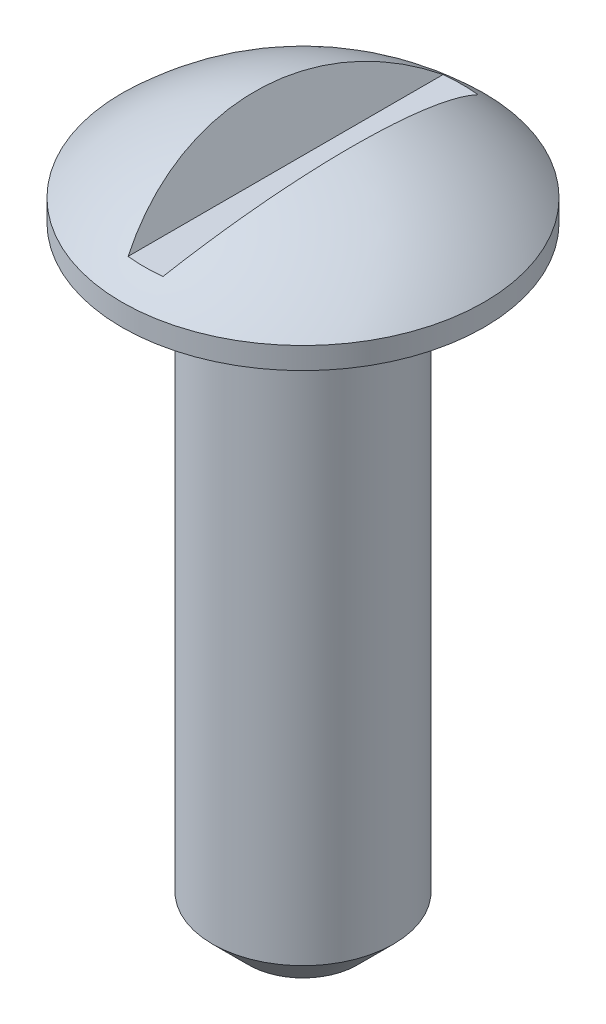
ISO-10303-21;
HEADER;
FILE_DESCRIPTION(('STEP AP214'),'2;1');
FILE_NAME('part.step','',(''),(''),'','','');
FILE_SCHEMA(('AUTOMOTIVE_DESIGN { 1 0 10303 214 1 1 1 1 }'));
ENDSEC;
DATA;
#1=APPLICATION_CONTEXT('core data for automotive mechanical design processes');
#2=APPLICATION_PROTOCOL_DEFINITION('international standard','automotive_design',2000,#1);
#3=PRODUCT_CONTEXT('',#1,'mechanical');
#4=PRODUCT('Part','Part','',(#3));
#5=PRODUCT_RELATED_PRODUCT_CATEGORY('part','',(#4));
#6=PRODUCT_DEFINITION_FORMATION('','',#4);
#7=PRODUCT_DEFINITION_CONTEXT('part definition',#1,'design');
#8=PRODUCT_DEFINITION('design','',#6,#7);
#9=PRODUCT_DEFINITION_SHAPE('','',#8);
#10=(LENGTH_UNIT() NAMED_UNIT(*) SI_UNIT(.MILLI.,.METRE.));
#11=(NAMED_UNIT(*) PLANE_ANGLE_UNIT() SI_UNIT($,.RADIAN.));
#12=(NAMED_UNIT(*) SI_UNIT($,.STERADIAN.) SOLID_ANGLE_UNIT());
#13=UNCERTAINTY_MEASURE_WITH_UNIT(LENGTH_MEASURE(1.E-05),#10,'distance_accuracy_value','');
#14=(GEOMETRIC_REPRESENTATION_CONTEXT(3) GLOBAL_UNCERTAINTY_ASSIGNED_CONTEXT((#13)) GLOBAL_UNIT_ASSIGNED_CONTEXT((#10,
#11,#12)) REPRESENTATION_CONTEXT('',''));
#15=CARTESIAN_POINT('',(0.,0.,0.));
#16=DIRECTION('',(0.,0.,1.));
#17=DIRECTION('',(1.,0.,0.));
#18=AXIS2_PLACEMENT_3D('',#15,#16,#17);
#19=CARTESIAN_POINT('',(0.,0.,0.));
#20=DIRECTION('',(0.,-1.,0.));
#21=DIRECTION('',(0.,0.,-1.));
#22=AXIS2_PLACEMENT_3D('',#19,#20,#21);
#23=PLANE('',#22);
#24=CARTESIAN_POINT('',(0.,0.,0.));
#25=DIRECTION('',(0.,-1.,0.));
#26=DIRECTION('',(0.,0.,-1.));
#27=AXIS2_PLACEMENT_3D('',#24,#25,#26);
#28=CIRCLE('',#27,3.81);
#29=CARTESIAN_POINT('',(0.,0.,-3.81));
#30=VERTEX_POINT('',#29);
#31=EDGE_CURVE('E11',#30,#30,#28,.T.);
#32=ORIENTED_EDGE('',*,*,#31,.T.);
#33=EDGE_LOOP('',(#32));
#34=FACE_BOUND('',#33,.T.);
#35=ADVANCED_FACE('F39',(#34),#23,.T.);
#36=CARTESIAN_POINT('',(0.,0.,0.));
#37=DIRECTION('',(0.,1.,0.));
#38=DIRECTION('',(0.,0.,1.));
#39=AXIS2_PLACEMENT_3D('',#36,#37,#38);
#40=CYLINDRICAL_SURFACE('',#39,6.35);
#41=CARTESIAN_POINT('',(0.,2.53999999999999,0.));
#42=DIRECTION('',(0.,-1.,0.));
#43=DIRECTION('',(0.,0.,-1.));
#44=AXIS2_PLACEMENT_3D('',#41,#42,#43);
#45=CIRCLE('',#44,6.35);
#46=CARTESIAN_POINT('',(0.,2.53999999999999,-6.35));
#47=VERTEX_POINT('',#46);
#48=EDGE_CURVE('E48',#47,#47,#45,.F.);
#49=ORIENTED_EDGE('',*,*,#48,.T.);
#50=EDGE_LOOP('',(#49));
#51=FACE_BOUND('',#50,.T.);
#52=CARTESIAN_POINT('',(0.,43.18,0.));
#53=DIRECTION('',(0.,1.,0.));
#54=DIRECTION('',(0.,0.,1.));
#55=AXIS2_PLACEMENT_3D('',#52,#53,#54);
#56=CIRCLE('',#55,6.35);
#57=CARTESIAN_POINT('',(0.,43.18,6.35));
#58=VERTEX_POINT('',#57);
#59=EDGE_CURVE('E72',#58,#58,#56,.T.);
#60=ORIENTED_EDGE('',*,*,#59,.F.);
#61=EDGE_LOOP('',(#60));
#62=FACE_BOUND('',#61,.T.);
#63=ADVANCED_FACE('F96',(#51,#62),#40,.T.);
#64=CARTESIAN_POINT('',(-6.35,43.18,0.));
#65=DIRECTION('',(0.,-1.,0.));
#66=DIRECTION('',(0.,0.,-1.));
#67=AXIS2_PLACEMENT_3D('',#64,#65,#66);
#68=PLANE('',#67);
#69=ORIENTED_EDGE('',*,*,#59,.T.);
#70=EDGE_LOOP('',(#69));
#71=FACE_BOUND('',#70,.T.);
#72=CARTESIAN_POINT('',(0.,43.18,0.));
#73=DIRECTION('',(0.,1.,0.));
#74=DIRECTION('',(0.,0.,1.));
#75=AXIS2_PLACEMENT_3D('',#72,#73,#74);
#76=CIRCLE('',#75,12.7);
#77=CARTESIAN_POINT('',(0.,43.18,12.7));
#78=VERTEX_POINT('',#77);
#79=EDGE_CURVE('E86',#78,#78,#76,.T.);
#80=ORIENTED_EDGE('',*,*,#79,.F.);
#81=EDGE_LOOP('',(#80));
#82=FACE_BOUND('',#81,.T.);
#83=ADVANCED_FACE('F112',(#71,#82),#68,.T.);
#84=CARTESIAN_POINT('',(0.,0.,0.));
#85=DIRECTION('',(0.,1.,0.));
#86=DIRECTION('',(0.,0.,1.));
#87=AXIS2_PLACEMENT_3D('',#84,#85,#86);
#88=CYLINDRICAL_SURFACE('',#87,12.7);
#89=ORIENTED_EDGE('',*,*,#79,.T.);
#90=EDGE_LOOP('',(#89));
#91=FACE_BOUND('',#90,.T.);
#92=CARTESIAN_POINT('',(0.,44.704,0.));
#93=DIRECTION('',(0.,1.,0.));
#94=DIRECTION('',(0.,0.,1.));
#95=AXIS2_PLACEMENT_3D('',#92,#93,#94);
#96=CIRCLE('',#95,12.7);
#97=CARTESIAN_POINT('',(0.,44.704,12.7));
#98=VERTEX_POINT('',#97);
#99=EDGE_CURVE('E83',#98,#98,#96,.T.);
#100=ORIENTED_EDGE('',*,*,#99,.F.);
#101=EDGE_LOOP('',(#100));
#102=FACE_BOUND('',#101,.T.);
#103=ADVANCED_FACE('F117',(#91,#102),#88,.T.);
#104=CARTESIAN_POINT('',(0.,31.369,0.));
#105=DIRECTION('',(0.,0.,1.));
#106=DIRECTION('',(1.,0.,0.));
#107=AXIS2_PLACEMENT_3D('',#104,#105,#106);
#108=SPHERICAL_SURFACE('',#107,18.415);
#109=CARTESIAN_POINT('',(5.75441705530127,35.0017621584837,0.));
#110=DIRECTION('',(-0.84559546912563,-0.533824224435541,0.));
#111=DIRECTION('',(0.533824224435541,-0.84559546912563,0.));
#112=AXIS2_PLACEMENT_3D('',#109,#110,#111);
#113=CIRCLE('',#112,17.1114566432419);
#114=CARTESIAN_POINT('',(-1.2214464709935,46.051763865152,-11.0470239792754));
#115=VERTEX_POINT('',#114);
#116=CARTESIAN_POINT('',(-1.2214464709935,46.051763865152,11.0470239792754));
#117=VERTEX_POINT('',#116);
#118=EDGE_CURVE('E59',#115,#117,#113,.F.);
#119=ORIENTED_EDGE('',*,*,#118,.F.);
#120=CARTESIAN_POINT('',(0.,46.051763865152,0.));
#121=DIRECTION('',(0.,-1.,0.));
#122=DIRECTION('',(0.,0.,-1.));
#123=AXIS2_PLACEMENT_3D('',#120,#121,#122);
#124=CIRCLE('',#123,11.1143452474803);
#125=CARTESIAN_POINT('',(1.2214464709935,46.051763865152,-11.0470239792754));
#126=VERTEX_POINT('',#125);
#127=EDGE_CURVE('E68',#126,#115,#124,.F.);
#128=ORIENTED_EDGE('',*,*,#127,.F.);
#129=CARTESIAN_POINT('',(-5.75441705530127,35.0017621584837,0.));
#130=DIRECTION('',(0.84559546912563,-0.533824224435541,0.));
#131=DIRECTION('',(0.533824224435541,0.84559546912563,0.));
#132=AXIS2_PLACEMENT_3D('',#129,#130,#131);
#133=CIRCLE('',#132,17.1114566432419);
#134=CARTESIAN_POINT('',(1.2214464709935,46.051763865152,11.0470239792754));
#135=VERTEX_POINT('',#134);
#136=EDGE_CURVE('E65',#135,#126,#133,.F.);
#137=ORIENTED_EDGE('',*,*,#136,.F.);
#138=EDGE_CURVE('E55',#117,#135,#124,.F.);
#139=ORIENTED_EDGE('',*,*,#138,.F.);
#140=EDGE_LOOP('',(#119,#128,#137,#139));
#141=FACE_BOUND('',#140,.T.);
#142=ORIENTED_EDGE('',*,*,#99,.T.);
#143=EDGE_LOOP('',(#142));
#144=FACE_BOUND('',#143,.T.);
#145=ADVANCED_FACE('F66',(#141,#144),#108,.T.);
#146=CARTESIAN_POINT('',(-3.38009301623971,49.4711323661487,84.6753518073056));
#147=DIRECTION('',(-0.84559546912563,-0.533824224435541,0.));
#148=DIRECTION('',(0.533824224435541,-0.84559546912563,0.));
#149=AXIS2_PLACEMENT_3D('',#146,#147,#148);
#150=PLANE('',#149);
#151=DIRECTION('',(0.,0.,-1.));
#152=VECTOR('',#151,1.);
#153=CARTESIAN_POINT('',(-1.2214464709935,46.051763865152,84.6753518073056));
#154=LINE('',#153,#152);
#155=EDGE_CURVE('E79',#117,#115,#154,.T.);
#156=ORIENTED_EDGE('',*,*,#155,.T.);
#157=ORIENTED_EDGE('',*,*,#118,.T.);
#158=EDGE_LOOP('',(#156,#157));
#159=FACE_BOUND('',#158,.T.);
#160=ADVANCED_FACE('F116',(#159),#150,.F.);
#161=CARTESIAN_POINT('',(-1.2214464709935,46.051763865152,84.6753518073056));
#162=DIRECTION('',(0.,-1.,0.));
#163=DIRECTION('',(0.,0.,-1.));
#164=AXIS2_PLACEMENT_3D('',#161,#162,#163);
#165=PLANE('',#164);
#166=ORIENTED_EDGE('',*,*,#155,.F.);
#167=ORIENTED_EDGE('',*,*,#138,.T.);
#168=DIRECTION('',(0.,0.,-1.));
#169=VECTOR('',#168,1.);
#170=CARTESIAN_POINT('',(1.2214464709935,46.051763865152,84.6753518073056));
#171=LINE('',#170,#169);
#172=EDGE_CURVE('E77',#135,#126,#171,.T.);
#173=ORIENTED_EDGE('',*,*,#172,.T.);
#174=ORIENTED_EDGE('',*,*,#127,.T.);
#175=EDGE_LOOP('',(#166,#167,#173,#174));
#176=FACE_BOUND('',#175,.T.);
#177=ADVANCED_FACE('F76',(#176),#165,.F.);
#178=CARTESIAN_POINT('',(3.38009301623971,49.4711323661487,84.6753518073056));
#179=DIRECTION('',(0.84559546912563,-0.533824224435541,0.));
#180=DIRECTION('',(0.533824224435541,0.84559546912563,0.));
#181=AXIS2_PLACEMENT_3D('',#178,#179,#180);
#182=PLANE('',#181);
#183=ORIENTED_EDGE('',*,*,#136,.T.);
#184=ORIENTED_EDGE('',*,*,#172,.F.);
#185=EDGE_LOOP('',(#183,#184));
#186=FACE_BOUND('',#185,.T.);
#187=ADVANCED_FACE('F81',(#186),#182,.F.);
#188=CARTESIAN_POINT('',(0.,2.53999999999999,0.));
#189=DIRECTION('',(0.,1.,0.));
#190=DIRECTION('',(0.,0.,1.));
#191=AXIS2_PLACEMENT_3D('',#188,#189,#190);
#192=CONICAL_SURFACE('',#191,6.35,0.78539816339745);
#193=ORIENTED_EDGE('',*,*,#31,.F.);
#194=EDGE_LOOP('',(#193));
#195=FACE_BOUND('',#194,.T.);
#196=ORIENTED_EDGE('',*,*,#48,.F.);
#197=EDGE_LOOP('',(#196));
#198=FACE_BOUND('',#197,.T.);
#199=ADVANCED_FACE('F42',(#195,#198),#192,.T.);
#200=CLOSED_SHELL('',(#35,#63,#83,#103,#145,#160,#177,#187,#199));
#201=MANIFOLD_SOLID_BREP('B2',#200);
#202=ADVANCED_BREP_SHAPE_REPRESENTATION('',(#18,#201),#14);
#203=SHAPE_DEFINITION_REPRESENTATION(#9,#202);
ENDSEC;
END-ISO-10303-21;
